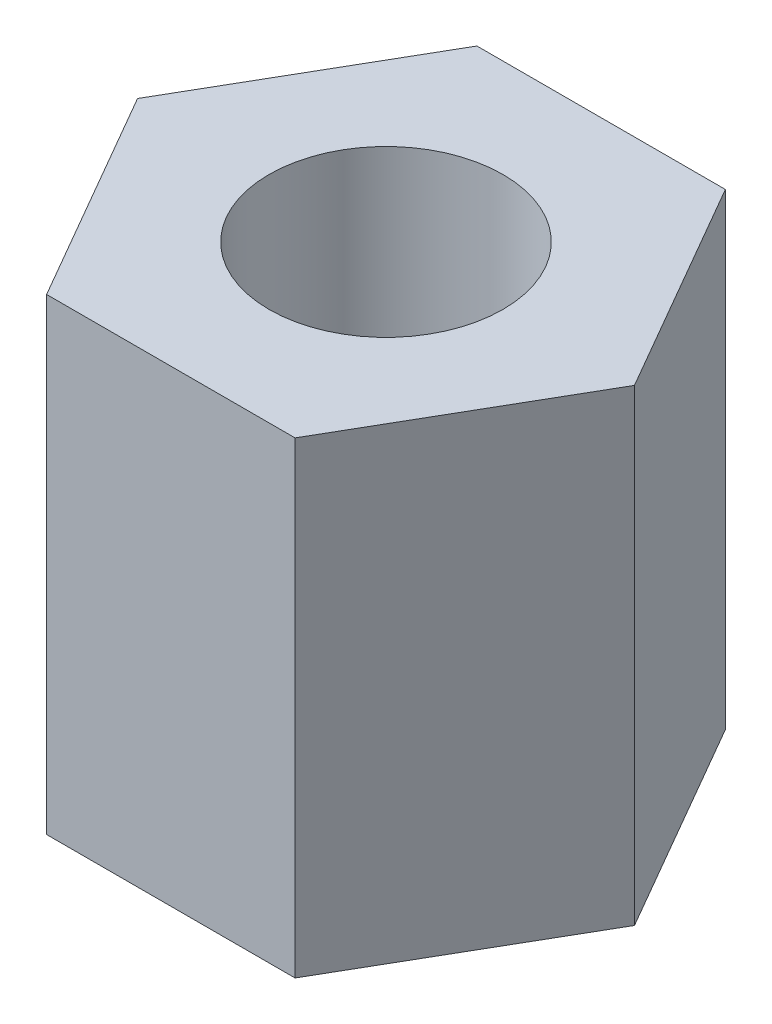
ISO-10303-21;
HEADER;
FILE_DESCRIPTION(('STEP AP214'),'2;1');
FILE_NAME('part.step','',(''),(''),'','','');
FILE_SCHEMA(('AUTOMOTIVE_DESIGN { 1 0 10303 214 1 1 1 1 }'));
ENDSEC;
DATA;
#1=APPLICATION_CONTEXT('core data for automotive mechanical design processes');
#2=APPLICATION_PROTOCOL_DEFINITION('international standard','automotive_design',2000,#1);
#3=PRODUCT_CONTEXT('',#1,'mechanical');
#4=PRODUCT('Part','Part','',(#3));
#5=PRODUCT_RELATED_PRODUCT_CATEGORY('part','',(#4));
#6=PRODUCT_DEFINITION_FORMATION('','',#4);
#7=PRODUCT_DEFINITION_CONTEXT('part definition',#1,'design');
#8=PRODUCT_DEFINITION('design','',#6,#7);
#9=PRODUCT_DEFINITION_SHAPE('','',#8);
#10=(LENGTH_UNIT() NAMED_UNIT(*) SI_UNIT(.MILLI.,.METRE.));
#11=(NAMED_UNIT(*) PLANE_ANGLE_UNIT() SI_UNIT($,.RADIAN.));
#12=(NAMED_UNIT(*) SI_UNIT($,.STERADIAN.) SOLID_ANGLE_UNIT());
#13=UNCERTAINTY_MEASURE_WITH_UNIT(LENGTH_MEASURE(1.E-05),#10,'distance_accuracy_value','');
#14=(GEOMETRIC_REPRESENTATION_CONTEXT(3) GLOBAL_UNCERTAINTY_ASSIGNED_CONTEXT((#13)) GLOBAL_UNIT_ASSIGNED_CONTEXT((#10,
#11,#12)) REPRESENTATION_CONTEXT('',''));
#15=CARTESIAN_POINT('',(0.,0.,0.));
#16=DIRECTION('',(0.,0.,1.));
#17=DIRECTION('',(1.,0.,0.));
#18=AXIS2_PLACEMENT_3D('',#15,#16,#17);
#19=CARTESIAN_POINT('',(-1.32790561913614,2.5,2.3));
#20=DIRECTION('',(0.,0.,-1.));
#21=DIRECTION('',(-1.,0.,0.));
#22=AXIS2_PLACEMENT_3D('',#19,#20,#21);
#23=PLANE('',#22);
#24=DIRECTION('',(1.,0.,0.));
#25=VECTOR('',#24,1.);
#26=CARTESIAN_POINT('',(-1.32790561913614,-2.5,2.3));
#27=LINE('',#26,#25);
#28=CARTESIAN_POINT('',(-1.32790561913614,-2.5,2.3));
#29=VERTEX_POINT('',#28);
#30=CARTESIAN_POINT('',(1.32790561913614,-2.5,2.3));
#31=VERTEX_POINT('',#30);
#32=EDGE_CURVE('E121',#29,#31,#27,.T.);
#33=ORIENTED_EDGE('',*,*,#32,.T.);
#34=DIRECTION('',(0.,-1.,0.));
#35=VECTOR('',#34,1.);
#36=CARTESIAN_POINT('',(1.32790561913614,2.5,2.3));
#37=LINE('',#36,#35);
#38=CARTESIAN_POINT('',(1.32790561913614,2.5,2.3));
#39=VERTEX_POINT('',#38);
#40=EDGE_CURVE('E11',#39,#31,#37,.T.);
#41=ORIENTED_EDGE('',*,*,#40,.F.);
#42=DIRECTION('',(1.,0.,0.));
#43=VECTOR('',#42,1.);
#44=CARTESIAN_POINT('',(-1.32790561913614,2.5,2.3));
#45=LINE('',#44,#43);
#46=CARTESIAN_POINT('',(-1.32790561913614,2.5,2.3));
#47=VERTEX_POINT('',#46);
#48=EDGE_CURVE('E132',#47,#39,#45,.T.);
#49=ORIENTED_EDGE('',*,*,#48,.F.);
#50=DIRECTION('',(0.,-1.,0.));
#51=VECTOR('',#50,1.);
#52=CARTESIAN_POINT('',(-1.32790561913614,2.5,2.3));
#53=LINE('',#52,#51);
#54=EDGE_CURVE('E117',#47,#29,#53,.T.);
#55=ORIENTED_EDGE('',*,*,#54,.T.);
#56=EDGE_LOOP('',(#33,#41,#49,#55));
#57=FACE_BOUND('',#56,.T.);
#58=ADVANCED_FACE('F37',(#57),#23,.F.);
#59=CARTESIAN_POINT('',(1.32790561913614,2.5,2.3));
#60=DIRECTION('',(-0.866025403784438,0.,-0.5));
#61=DIRECTION('',(-0.5,0.,0.866025403784439));
#62=AXIS2_PLACEMENT_3D('',#59,#60,#61);
#63=PLANE('',#62);
#64=DIRECTION('',(0.5,0.,-0.866025403784438));
#65=VECTOR('',#64,1.);
#66=CARTESIAN_POINT('',(1.32790561913614,-2.5,2.3));
#67=LINE('',#66,#65);
#68=CARTESIAN_POINT('',(2.65581123827228,-2.5,0.));
#69=VERTEX_POINT('',#68);
#70=EDGE_CURVE('E124',#31,#69,#67,.T.);
#71=ORIENTED_EDGE('',*,*,#70,.T.);
#72=DIRECTION('',(0.,-1.,0.));
#73=VECTOR('',#72,1.);
#74=CARTESIAN_POINT('',(2.65581123827228,2.5,0.));
#75=LINE('',#74,#73);
#76=CARTESIAN_POINT('',(2.65581123827228,2.5,0.));
#77=VERTEX_POINT('',#76);
#78=EDGE_CURVE('E45',#77,#69,#75,.T.);
#79=ORIENTED_EDGE('',*,*,#78,.F.);
#80=DIRECTION('',(0.5,0.,-0.866025403784438));
#81=VECTOR('',#80,1.);
#82=CARTESIAN_POINT('',(1.32790561913614,2.5,2.3));
#83=LINE('',#82,#81);
#84=EDGE_CURVE('E90',#39,#77,#83,.T.);
#85=ORIENTED_EDGE('',*,*,#84,.F.);
#86=ORIENTED_EDGE('',*,*,#40,.T.);
#87=EDGE_LOOP('',(#71,#79,#85,#86));
#88=FACE_BOUND('',#87,.T.);
#89=ADVANCED_FACE('F157',(#88),#63,.F.);
#90=CARTESIAN_POINT('',(2.65581123827228,2.5,0.));
#91=DIRECTION('',(-0.866025403784439,0.,0.5));
#92=DIRECTION('',(0.5,0.,0.866025403784439));
#93=AXIS2_PLACEMENT_3D('',#90,#91,#92);
#94=PLANE('',#93);
#95=DIRECTION('',(-0.5,0.,-0.866025403784439));
#96=VECTOR('',#95,1.);
#97=CARTESIAN_POINT('',(2.65581123827228,-2.5,0.));
#98=LINE('',#97,#96);
#99=CARTESIAN_POINT('',(1.32790561913614,-2.5,-2.3));
#100=VERTEX_POINT('',#99);
#101=EDGE_CURVE('E127',#69,#100,#98,.T.);
#102=ORIENTED_EDGE('',*,*,#101,.T.);
#103=DIRECTION('',(0.,-1.,0.));
#104=VECTOR('',#103,1.);
#105=CARTESIAN_POINT('',(1.32790561913614,2.5,-2.3));
#106=LINE('',#105,#104);
#107=CARTESIAN_POINT('',(1.32790561913614,2.5,-2.3));
#108=VERTEX_POINT('',#107);
#109=EDGE_CURVE('E112',#108,#100,#106,.T.);
#110=ORIENTED_EDGE('',*,*,#109,.F.);
#111=DIRECTION('',(-0.5,0.,-0.866025403784439));
#112=VECTOR('',#111,1.);
#113=CARTESIAN_POINT('',(2.65581123827228,2.5,0.));
#114=LINE('',#113,#112);
#115=EDGE_CURVE('E103',#77,#108,#114,.T.);
#116=ORIENTED_EDGE('',*,*,#115,.F.);
#117=ORIENTED_EDGE('',*,*,#78,.T.);
#118=EDGE_LOOP('',(#102,#110,#116,#117));
#119=FACE_BOUND('',#118,.T.);
#120=ADVANCED_FACE('F138',(#119),#94,.F.);
#121=CARTESIAN_POINT('',(1.32790561913614,2.5,-2.3));
#122=DIRECTION('',(0.,0.,1.));
#123=DIRECTION('',(1.,0.,0.));
#124=AXIS2_PLACEMENT_3D('',#121,#122,#123);
#125=PLANE('',#124);
#126=DIRECTION('',(-1.,0.,0.));
#127=VECTOR('',#126,1.);
#128=CARTESIAN_POINT('',(1.32790561913614,-2.5,-2.3));
#129=LINE('',#128,#127);
#130=CARTESIAN_POINT('',(-1.32790561913614,-2.5,-2.3));
#131=VERTEX_POINT('',#130);
#132=EDGE_CURVE('E111',#100,#131,#129,.T.);
#133=ORIENTED_EDGE('',*,*,#132,.T.);
#134=DIRECTION('',(0.,-1.,0.));
#135=VECTOR('',#134,1.);
#136=CARTESIAN_POINT('',(-1.32790561913614,2.5,-2.3));
#137=LINE('',#136,#135);
#138=CARTESIAN_POINT('',(-1.32790561913614,2.5,-2.3));
#139=VERTEX_POINT('',#138);
#140=EDGE_CURVE('E108',#139,#131,#137,.T.);
#141=ORIENTED_EDGE('',*,*,#140,.F.);
#142=DIRECTION('',(-1.,0.,0.));
#143=VECTOR('',#142,1.);
#144=CARTESIAN_POINT('',(1.32790561913614,2.5,-2.3));
#145=LINE('',#144,#143);
#146=EDGE_CURVE('E97',#108,#139,#145,.T.);
#147=ORIENTED_EDGE('',*,*,#146,.F.);
#148=ORIENTED_EDGE('',*,*,#109,.T.);
#149=EDGE_LOOP('',(#133,#141,#147,#148));
#150=FACE_BOUND('',#149,.T.);
#151=ADVANCED_FACE('F109',(#150),#125,.F.);
#152=CARTESIAN_POINT('',(-1.32790561913614,2.5,-2.3));
#153=DIRECTION('',(0.866025403784439,0.,0.5));
#154=DIRECTION('',(0.5,0.,-0.866025403784439));
#155=AXIS2_PLACEMENT_3D('',#152,#153,#154);
#156=PLANE('',#155);
#157=DIRECTION('',(-0.5,0.,0.866025403784439));
#158=VECTOR('',#157,1.);
#159=CARTESIAN_POINT('',(-1.32790561913614,-2.5,-2.3));
#160=LINE('',#159,#158);
#161=CARTESIAN_POINT('',(-2.65581123827228,-2.5,0.));
#162=VERTEX_POINT('',#161);
#163=EDGE_CURVE('E76',#131,#162,#160,.T.);
#164=ORIENTED_EDGE('',*,*,#163,.T.);
#165=DIRECTION('',(0.,-1.,0.));
#166=VECTOR('',#165,1.);
#167=CARTESIAN_POINT('',(-2.65581123827228,2.5,0.));
#168=LINE('',#167,#166);
#169=CARTESIAN_POINT('',(-2.65581123827228,2.5,0.));
#170=VERTEX_POINT('',#169);
#171=EDGE_CURVE('E113',#170,#162,#168,.T.);
#172=ORIENTED_EDGE('',*,*,#171,.F.);
#173=DIRECTION('',(-0.5,0.,0.866025403784439));
#174=VECTOR('',#173,1.);
#175=CARTESIAN_POINT('',(-1.32790561913614,2.5,-2.3));
#176=LINE('',#175,#174);
#177=EDGE_CURVE('E101',#139,#170,#176,.T.);
#178=ORIENTED_EDGE('',*,*,#177,.F.);
#179=ORIENTED_EDGE('',*,*,#140,.T.);
#180=EDGE_LOOP('',(#164,#172,#178,#179));
#181=FACE_BOUND('',#180,.T.);
#182=ADVANCED_FACE('F115',(#181),#156,.F.);
#183=CARTESIAN_POINT('',(-2.65581123827228,2.5,0.));
#184=DIRECTION('',(0.866025403784439,0.,-0.5));
#185=DIRECTION('',(-0.5,0.,-0.866025403784439));
#186=AXIS2_PLACEMENT_3D('',#183,#184,#185);
#187=PLANE('',#186);
#188=DIRECTION('',(0.5,0.,0.866025403784439));
#189=VECTOR('',#188,1.);
#190=CARTESIAN_POINT('',(-2.65581123827228,-2.5,0.));
#191=LINE('',#190,#189);
#192=EDGE_CURVE('E82',#162,#29,#191,.T.);
#193=ORIENTED_EDGE('',*,*,#192,.T.);
#194=ORIENTED_EDGE('',*,*,#54,.F.);
#195=DIRECTION('',(0.5,0.,0.866025403784439));
#196=VECTOR('',#195,1.);
#197=CARTESIAN_POINT('',(-2.65581123827228,2.5,0.));
#198=LINE('',#197,#196);
#199=EDGE_CURVE('E53',#170,#47,#198,.T.);
#200=ORIENTED_EDGE('',*,*,#199,.F.);
#201=ORIENTED_EDGE('',*,*,#171,.T.);
#202=EDGE_LOOP('',(#193,#194,#200,#201));
#203=FACE_BOUND('',#202,.T.);
#204=ADVANCED_FACE('F145',(#203),#187,.F.);
#205=CARTESIAN_POINT('',(0.,2.5,0.));
#206=DIRECTION('',(0.,1.,0.));
#207=DIRECTION('',(0.,0.,1.));
#208=AXIS2_PLACEMENT_3D('',#205,#206,#207);
#209=PLANE('',#208);
#210=CARTESIAN_POINT('',(0.,2.5,0.));
#211=DIRECTION('',(0.,1.,0.));
#212=DIRECTION('',(0.,0.,1.));
#213=AXIS2_PLACEMENT_3D('',#210,#211,#212);
#214=CIRCLE('',#213,1.25);
#215=CARTESIAN_POINT('',(0.,2.5,1.25));
#216=VERTEX_POINT('',#215);
#217=EDGE_CURVE('E226',#216,#216,#214,.T.);
#218=ORIENTED_EDGE('',*,*,#217,.F.);
#219=EDGE_LOOP('',(#218));
#220=FACE_BOUND('',#219,.T.);
#221=ORIENTED_EDGE('',*,*,#48,.T.);
#222=ORIENTED_EDGE('',*,*,#84,.T.);
#223=ORIENTED_EDGE('',*,*,#115,.T.);
#224=ORIENTED_EDGE('',*,*,#146,.T.);
#225=ORIENTED_EDGE('',*,*,#177,.T.);
#226=ORIENTED_EDGE('',*,*,#199,.T.);
#227=EDGE_LOOP('',(#221,#222,#223,#224,#225,#226));
#228=FACE_BOUND('',#227,.T.);
#229=ADVANCED_FACE('F99',(#220,#228),#209,.T.);
#230=CARTESIAN_POINT('',(0.,-2.5,0.));
#231=DIRECTION('',(0.,1.,0.));
#232=DIRECTION('',(0.,0.,1.));
#233=AXIS2_PLACEMENT_3D('',#230,#231,#232);
#234=PLANE('',#233);
#235=CARTESIAN_POINT('',(0.,-2.5,0.));
#236=DIRECTION('',(0.,1.,0.));
#237=DIRECTION('',(0.,0.,1.));
#238=AXIS2_PLACEMENT_3D('',#235,#236,#237);
#239=CIRCLE('',#238,1.25);
#240=CARTESIAN_POINT('',(0.,-2.5,1.25));
#241=VERTEX_POINT('',#240);
#242=EDGE_CURVE('E125',#241,#241,#239,.T.);
#243=ORIENTED_EDGE('',*,*,#242,.T.);
#244=EDGE_LOOP('',(#243));
#245=FACE_BOUND('',#244,.T.);
#246=ORIENTED_EDGE('',*,*,#32,.F.);
#247=ORIENTED_EDGE('',*,*,#192,.F.);
#248=ORIENTED_EDGE('',*,*,#163,.F.);
#249=ORIENTED_EDGE('',*,*,#132,.F.);
#250=ORIENTED_EDGE('',*,*,#101,.F.);
#251=ORIENTED_EDGE('',*,*,#70,.F.);
#252=EDGE_LOOP('',(#246,#247,#248,#249,#250,#251));
#253=FACE_BOUND('',#252,.T.);
#254=ADVANCED_FACE('F141',(#245,#253),#234,.F.);
#255=CARTESIAN_POINT('',(0.,2.5,0.));
#256=DIRECTION('',(0.,1.,0.));
#257=DIRECTION('',(0.,0.,1.));
#258=AXIS2_PLACEMENT_3D('',#255,#256,#257);
#259=CYLINDRICAL_SURFACE('',#258,1.25);
#260=ORIENTED_EDGE('',*,*,#242,.F.);
#261=EDGE_LOOP('',(#260));
#262=FACE_BOUND('',#261,.T.);
#263=ORIENTED_EDGE('',*,*,#217,.T.);
#264=EDGE_LOOP('',(#263));
#265=FACE_BOUND('',#264,.T.);
#266=ADVANCED_FACE('F194',(#262,#265),#259,.F.);
#267=CLOSED_SHELL('',(#58,#89,#120,#151,#182,#204,#229,#254,#266));
#268=MANIFOLD_SOLID_BREP('B2',#267);
#269=ADVANCED_BREP_SHAPE_REPRESENTATION('',(#18,#268),#14);
#270=SHAPE_DEFINITION_REPRESENTATION(#9,#269);
ENDSEC;
END-ISO-10303-21;
